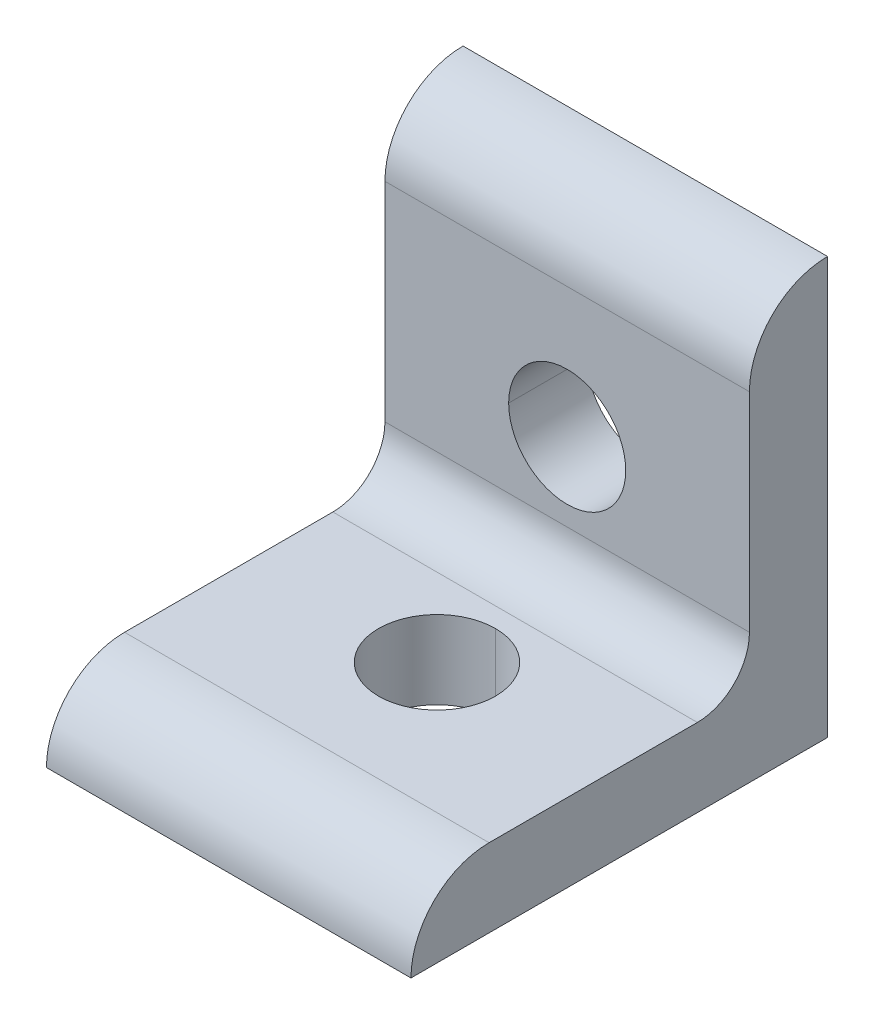
ISO-10303-21;
HEADER;
FILE_DESCRIPTION(('STEP AP214'),'2;1');
FILE_NAME('part.step','',(''),(''),'','','');
FILE_SCHEMA(('AUTOMOTIVE_DESIGN { 1 0 10303 214 1 1 1 1 }'));
ENDSEC;
DATA;
#1=APPLICATION_CONTEXT('core data for automotive mechanical design processes');
#2=APPLICATION_PROTOCOL_DEFINITION('international standard','automotive_design',2000,#1);
#3=PRODUCT_CONTEXT('',#1,'mechanical');
#4=PRODUCT('Part','Part','',(#3));
#5=PRODUCT_RELATED_PRODUCT_CATEGORY('part','',(#4));
#6=PRODUCT_DEFINITION_FORMATION('','',#4);
#7=PRODUCT_DEFINITION_CONTEXT('part definition',#1,'design');
#8=PRODUCT_DEFINITION('design','',#6,#7);
#9=PRODUCT_DEFINITION_SHAPE('','',#8);
#10=(LENGTH_UNIT() NAMED_UNIT(*) SI_UNIT(.MILLI.,.METRE.));
#11=(NAMED_UNIT(*) PLANE_ANGLE_UNIT() SI_UNIT($,.RADIAN.));
#12=(NAMED_UNIT(*) SI_UNIT($,.STERADIAN.) SOLID_ANGLE_UNIT());
#13=UNCERTAINTY_MEASURE_WITH_UNIT(LENGTH_MEASURE(1.E-05),#10,'distance_accuracy_value','');
#14=(GEOMETRIC_REPRESENTATION_CONTEXT(3) GLOBAL_UNCERTAINTY_ASSIGNED_CONTEXT((#13)) GLOBAL_UNIT_ASSIGNED_CONTEXT((#10,
#11,#12)) REPRESENTATION_CONTEXT('',''));
#15=CARTESIAN_POINT('',(0.,0.,0.));
#16=DIRECTION('',(0.,0.,1.));
#17=DIRECTION('',(1.,0.,0.));
#18=AXIS2_PLACEMENT_3D('',#15,#16,#17);
#19=CARTESIAN_POINT('',(11.1125,0.,20.6375));
#20=DIRECTION('',(-1.,0.,0.));
#21=DIRECTION('',(0.,-0.707106781186543,-0.707106781186552));
#22=AXIS2_PLACEMENT_3D('',#19,#20,#21);
#23=CYLINDRICAL_SURFACE('',#22,4.76249999999994);
#24=CARTESIAN_POINT('',(-11.1125,0.,20.6375));
#25=DIRECTION('',(1.,0.,0.));
#26=DIRECTION('',(0.,0.,-1.));
#27=AXIS2_PLACEMENT_3D('',#24,#25,#26);
#28=CIRCLE('',#27,4.76249999999994);
#29=CARTESIAN_POINT('',(-11.1125,4.7625,20.6375));
#30=VERTEX_POINT('',#29);
#31=CARTESIAN_POINT('',(-11.1125,0.,25.4));
#32=VERTEX_POINT('',#31);
#33=EDGE_CURVE('E11',#30,#32,#28,.T.);
#34=ORIENTED_EDGE('',*,*,#33,.T.);
#35=DIRECTION('',(-1.,0.,0.));
#36=VECTOR('',#35,1.);
#37=CARTESIAN_POINT('',(11.1125,0.,25.4));
#38=LINE('',#37,#36);
#39=CARTESIAN_POINT('',(11.1125,0.,25.4));
#40=VERTEX_POINT('',#39);
#41=EDGE_CURVE('E26',#40,#32,#38,.T.);
#42=ORIENTED_EDGE('',*,*,#41,.F.);
#43=CARTESIAN_POINT('',(11.1125,0.,20.6375));
#44=DIRECTION('',(1.,0.,0.));
#45=DIRECTION('',(0.,0.,-1.));
#46=AXIS2_PLACEMENT_3D('',#43,#44,#45);
#47=CIRCLE('',#46,4.76249999999994);
#48=CARTESIAN_POINT('',(11.1125,4.7625,20.6375));
#49=VERTEX_POINT('',#48);
#50=EDGE_CURVE('E269',#49,#40,#47,.T.);
#51=ORIENTED_EDGE('',*,*,#50,.F.);
#52=DIRECTION('',(-1.,0.,0.));
#53=VECTOR('',#52,1.);
#54=CARTESIAN_POINT('',(11.1125,4.7625,20.6375));
#55=LINE('',#54,#53);
#56=EDGE_CURVE('E264',#49,#30,#55,.T.);
#57=ORIENTED_EDGE('',*,*,#56,.T.);
#58=EDGE_LOOP('',(#34,#42,#51,#57));
#59=FACE_BOUND('',#58,.T.);
#60=ADVANCED_FACE('F17',(#59),#23,.T.);
#61=CARTESIAN_POINT('',(11.1125,4.7625,7.9375));
#62=DIRECTION('',(0.,-1.,0.));
#63=DIRECTION('',(0.,0.,-1.));
#64=AXIS2_PLACEMENT_3D('',#61,#62,#63);
#65=PLANE('',#64);
#66=CARTESIAN_POINT('',(0.,4.7625,12.7));
#67=DIRECTION('',(0.,1.,0.));
#68=DIRECTION('',(1.,0.,0.));
#69=AXIS2_PLACEMENT_3D('',#66,#67,#68);
#70=CIRCLE('',#69,3.5687);
#71=CARTESIAN_POINT('',(0.,4.7625,9.1313));
#72=VERTEX_POINT('',#71);
#73=CARTESIAN_POINT('',(0.,4.7625,16.2687));
#74=VERTEX_POINT('',#73);
#75=EDGE_CURVE('E259',#72,#74,#70,.T.);
#76=ORIENTED_EDGE('',*,*,#75,.F.);
#77=CARTESIAN_POINT('',(0.,4.7625,12.7));
#78=DIRECTION('',(0.,1.,0.));
#79=DIRECTION('',(0.,0.,1.));
#80=AXIS2_PLACEMENT_3D('',#77,#78,#79);
#81=CIRCLE('',#80,3.5687);
#82=EDGE_CURVE('E119',#74,#72,#81,.T.);
#83=ORIENTED_EDGE('',*,*,#82,.F.);
#84=EDGE_LOOP('',(#76,#83));
#85=FACE_BOUND('',#84,.T.);
#86=DIRECTION('',(0.,0.,1.));
#87=VECTOR('',#86,1.);
#88=CARTESIAN_POINT('',(-11.1125,4.7625,7.9375));
#89=LINE('',#88,#87);
#90=CARTESIAN_POINT('',(-11.1125,4.7625,7.9375));
#91=VERTEX_POINT('',#90);
#92=EDGE_CURVE('E249',#91,#30,#89,.T.);
#93=ORIENTED_EDGE('',*,*,#92,.T.);
#94=ORIENTED_EDGE('',*,*,#56,.F.);
#95=DIRECTION('',(0.,0.,1.));
#96=VECTOR('',#95,1.);
#97=CARTESIAN_POINT('',(11.1125,4.7625,7.9375));
#98=LINE('',#97,#96);
#99=CARTESIAN_POINT('',(11.1125,4.7625,7.9375));
#100=VERTEX_POINT('',#99);
#101=EDGE_CURVE('E243',#100,#49,#98,.T.);
#102=ORIENTED_EDGE('',*,*,#101,.F.);
#103=DIRECTION('',(-1.,0.,0.));
#104=VECTOR('',#103,1.);
#105=CARTESIAN_POINT('',(11.1125,4.7625,7.9375));
#106=LINE('',#105,#104);
#107=EDGE_CURVE('E238',#100,#91,#106,.T.);
#108=ORIENTED_EDGE('',*,*,#107,.T.);
#109=EDGE_LOOP('',(#93,#94,#102,#108));
#110=FACE_BOUND('',#109,.T.);
#111=ADVANCED_FACE('F287',(#85,#110),#65,.F.);
#112=CARTESIAN_POINT('',(11.1125,7.9375,7.9375));
#113=DIRECTION('',(-1.,0.,0.));
#114=DIRECTION('',(0.,0.707106781186548,0.707106781186547));
#115=AXIS2_PLACEMENT_3D('',#112,#113,#114);
#116=CYLINDRICAL_SURFACE('',#115,3.17499999999996);
#117=CARTESIAN_POINT('',(-11.1125,7.9375,7.9375));
#118=DIRECTION('',(1.,0.,0.));
#119=DIRECTION('',(0.,0.,-1.));
#120=AXIS2_PLACEMENT_3D('',#117,#118,#119);
#121=CIRCLE('',#120,3.17499999999996);
#122=CARTESIAN_POINT('',(-11.1125,7.9375,4.7625));
#123=VERTEX_POINT('',#122);
#124=EDGE_CURVE('E232',#91,#123,#121,.T.);
#125=ORIENTED_EDGE('',*,*,#124,.F.);
#126=ORIENTED_EDGE('',*,*,#107,.F.);
#127=CARTESIAN_POINT('',(11.1125,7.9375,7.9375));
#128=DIRECTION('',(1.,0.,0.));
#129=DIRECTION('',(0.,0.,-1.));
#130=AXIS2_PLACEMENT_3D('',#127,#128,#129);
#131=CIRCLE('',#130,3.17499999999996);
#132=CARTESIAN_POINT('',(11.1125,7.9375,4.7625));
#133=VERTEX_POINT('',#132);
#134=EDGE_CURVE('E227',#100,#133,#131,.T.);
#135=ORIENTED_EDGE('',*,*,#134,.T.);
#136=DIRECTION('',(-1.,0.,0.));
#137=VECTOR('',#136,1.);
#138=CARTESIAN_POINT('',(11.1125,7.9375,4.7625));
#139=LINE('',#138,#137);
#140=EDGE_CURVE('E222',#133,#123,#139,.T.);
#141=ORIENTED_EDGE('',*,*,#140,.T.);
#142=EDGE_LOOP('',(#125,#126,#135,#141));
#143=FACE_BOUND('',#142,.T.);
#144=ADVANCED_FACE('F305',(#143),#116,.F.);
#145=CARTESIAN_POINT('',(11.1125,20.6375,4.7625));
#146=DIRECTION('',(0.,0.,-1.));
#147=DIRECTION('',(-1.,0.,0.));
#148=AXIS2_PLACEMENT_3D('',#145,#146,#147);
#149=PLANE('',#148);
#150=CARTESIAN_POINT('',(0.,12.7,4.7625));
#151=DIRECTION('',(0.,0.,1.));
#152=DIRECTION('',(1.,0.,0.));
#153=AXIS2_PLACEMENT_3D('',#150,#151,#152);
#154=CIRCLE('',#153,3.5687);
#155=CARTESIAN_POINT('',(-3.5687,12.7,4.7625));
#156=VERTEX_POINT('',#155);
#157=CARTESIAN_POINT('',(3.5687,12.7,4.7625));
#158=VERTEX_POINT('',#157);
#159=EDGE_CURVE('E216',#156,#158,#154,.T.);
#160=ORIENTED_EDGE('',*,*,#159,.F.);
#161=CARTESIAN_POINT('',(0.,12.7,4.7625));
#162=DIRECTION('',(0.,0.,1.));
#163=DIRECTION('',(1.,0.,0.));
#164=AXIS2_PLACEMENT_3D('',#161,#162,#163);
#165=CIRCLE('',#164,3.5687);
#166=EDGE_CURVE('E210',#158,#156,#165,.T.);
#167=ORIENTED_EDGE('',*,*,#166,.F.);
#168=EDGE_LOOP('',(#160,#167));
#169=FACE_BOUND('',#168,.T.);
#170=DIRECTION('',(0.,-1.,0.));
#171=VECTOR('',#170,1.);
#172=CARTESIAN_POINT('',(-11.1125,20.6375,4.7625));
#173=LINE('',#172,#171);
#174=CARTESIAN_POINT('',(-11.1125,20.6375,4.7625));
#175=VERTEX_POINT('',#174);
#176=EDGE_CURVE('E204',#175,#123,#173,.T.);
#177=ORIENTED_EDGE('',*,*,#176,.T.);
#178=ORIENTED_EDGE('',*,*,#140,.F.);
#179=DIRECTION('',(0.,-1.,0.));
#180=VECTOR('',#179,1.);
#181=CARTESIAN_POINT('',(11.1125,20.6375,4.7625));
#182=LINE('',#181,#180);
#183=CARTESIAN_POINT('',(11.1125,20.6375,4.7625));
#184=VERTEX_POINT('',#183);
#185=EDGE_CURVE('E198',#184,#133,#182,.T.);
#186=ORIENTED_EDGE('',*,*,#185,.F.);
#187=DIRECTION('',(-1.,0.,0.));
#188=VECTOR('',#187,1.);
#189=CARTESIAN_POINT('',(11.1125,20.6375,4.7625));
#190=LINE('',#189,#188);
#191=EDGE_CURVE('E193',#184,#175,#190,.T.);
#192=ORIENTED_EDGE('',*,*,#191,.T.);
#193=EDGE_LOOP('',(#177,#178,#186,#192));
#194=FACE_BOUND('',#193,.T.);
#195=ADVANCED_FACE('F303',(#169,#194),#149,.F.);
#196=CARTESIAN_POINT('',(11.1125,20.6375,0.));
#197=DIRECTION('',(-1.,0.,0.));
#198=DIRECTION('',(0.,-0.707106781186553,-0.707106781186542));
#199=AXIS2_PLACEMENT_3D('',#196,#197,#198);
#200=CYLINDRICAL_SURFACE('',#199,4.76249999999994);
#201=CARTESIAN_POINT('',(-11.1125,20.6375,0.));
#202=DIRECTION('',(1.,0.,0.));
#203=DIRECTION('',(0.,0.,-1.));
#204=AXIS2_PLACEMENT_3D('',#201,#202,#203);
#205=CIRCLE('',#204,4.76249999999994);
#206=CARTESIAN_POINT('',(-11.1125,25.4,0.));
#207=VERTEX_POINT('',#206);
#208=EDGE_CURVE('E187',#207,#175,#205,.T.);
#209=ORIENTED_EDGE('',*,*,#208,.T.);
#210=ORIENTED_EDGE('',*,*,#191,.F.);
#211=CARTESIAN_POINT('',(11.1125,20.6375,0.));
#212=DIRECTION('',(1.,0.,0.));
#213=DIRECTION('',(0.,0.,-1.));
#214=AXIS2_PLACEMENT_3D('',#211,#212,#213);
#215=CIRCLE('',#214,4.76249999999994);
#216=CARTESIAN_POINT('',(11.1125,25.4,0.));
#217=VERTEX_POINT('',#216);
#218=EDGE_CURVE('E181',#217,#184,#215,.T.);
#219=ORIENTED_EDGE('',*,*,#218,.F.);
#220=DIRECTION('',(-1.,0.,0.));
#221=VECTOR('',#220,1.);
#222=CARTESIAN_POINT('',(11.1125,25.4,0.));
#223=LINE('',#222,#221);
#224=EDGE_CURVE('E176',#217,#207,#223,.T.);
#225=ORIENTED_EDGE('',*,*,#224,.T.);
#226=EDGE_LOOP('',(#209,#210,#219,#225));
#227=FACE_BOUND('',#226,.T.);
#228=ADVANCED_FACE('F301',(#227),#200,.T.);
#229=CARTESIAN_POINT('',(11.1125,0.,0.));
#230=DIRECTION('',(0.,0.,1.));
#231=DIRECTION('',(1.,0.,0.));
#232=AXIS2_PLACEMENT_3D('',#229,#230,#231);
#233=PLANE('',#232);
#234=CARTESIAN_POINT('',(0.,12.7,0.));
#235=DIRECTION('',(0.,0.,1.));
#236=DIRECTION('',(1.,0.,0.));
#237=AXIS2_PLACEMENT_3D('',#234,#235,#236);
#238=CIRCLE('',#237,3.5687);
#239=CARTESIAN_POINT('',(3.5687,12.7,0.));
#240=VERTEX_POINT('',#239);
#241=CARTESIAN_POINT('',(-3.5687,12.7,0.));
#242=VERTEX_POINT('',#241);
#243=EDGE_CURVE('E171',#240,#242,#238,.T.);
#244=ORIENTED_EDGE('',*,*,#243,.T.);
#245=CARTESIAN_POINT('',(0.,12.7,0.));
#246=DIRECTION('',(0.,0.,1.));
#247=DIRECTION('',(1.,0.,0.));
#248=AXIS2_PLACEMENT_3D('',#245,#246,#247);
#249=CIRCLE('',#248,3.5687);
#250=EDGE_CURVE('E166',#242,#240,#249,.T.);
#251=ORIENTED_EDGE('',*,*,#250,.T.);
#252=EDGE_LOOP('',(#244,#251));
#253=FACE_BOUND('',#252,.T.);
#254=DIRECTION('',(0.,1.,0.));
#255=VECTOR('',#254,1.);
#256=CARTESIAN_POINT('',(-11.1125,0.,0.));
#257=LINE('',#256,#255);
#258=CARTESIAN_POINT('',(-11.1125,0.,0.));
#259=VERTEX_POINT('',#258);
#260=EDGE_CURVE('E160',#259,#207,#257,.T.);
#261=ORIENTED_EDGE('',*,*,#260,.T.);
#262=ORIENTED_EDGE('',*,*,#224,.F.);
#263=DIRECTION('',(0.,1.,0.));
#264=VECTOR('',#263,1.);
#265=CARTESIAN_POINT('',(11.1125,0.,0.));
#266=LINE('',#265,#264);
#267=CARTESIAN_POINT('',(11.1125,0.,0.));
#268=VERTEX_POINT('',#267);
#269=EDGE_CURVE('E154',#268,#217,#266,.T.);
#270=ORIENTED_EDGE('',*,*,#269,.F.);
#271=DIRECTION('',(-1.,0.,0.));
#272=VECTOR('',#271,1.);
#273=CARTESIAN_POINT('',(11.1125,0.,0.));
#274=LINE('',#273,#272);
#275=EDGE_CURVE('E116',#268,#259,#274,.T.);
#276=ORIENTED_EDGE('',*,*,#275,.T.);
#277=EDGE_LOOP('',(#261,#262,#270,#276));
#278=FACE_BOUND('',#277,.T.);
#279=ADVANCED_FACE('F297',(#253,#278),#233,.F.);
#280=CARTESIAN_POINT('',(11.1125,0.,25.4));
#281=DIRECTION('',(0.,1.,0.));
#282=DIRECTION('',(0.,0.,1.));
#283=AXIS2_PLACEMENT_3D('',#280,#281,#282);
#284=PLANE('',#283);
#285=CARTESIAN_POINT('',(0.,0.,12.7));
#286=DIRECTION('',(0.,1.,0.));
#287=DIRECTION('',(1.,0.,0.));
#288=AXIS2_PLACEMENT_3D('',#285,#286,#287);
#289=CIRCLE('',#288,3.5687);
#290=CARTESIAN_POINT('',(0.,0.,9.1313));
#291=VERTEX_POINT('',#290);
#292=CARTESIAN_POINT('',(0.,0.,16.2687));
#293=VERTEX_POINT('',#292);
#294=EDGE_CURVE('E100',#291,#293,#289,.T.);
#295=ORIENTED_EDGE('',*,*,#294,.T.);
#296=CARTESIAN_POINT('',(0.,0.,12.7));
#297=DIRECTION('',(0.,1.,0.));
#298=DIRECTION('',(0.,0.,1.));
#299=AXIS2_PLACEMENT_3D('',#296,#297,#298);
#300=CIRCLE('',#299,3.5687);
#301=EDGE_CURVE('E96',#293,#291,#300,.T.);
#302=ORIENTED_EDGE('',*,*,#301,.T.);
#303=EDGE_LOOP('',(#295,#302));
#304=FACE_BOUND('',#303,.T.);
#305=DIRECTION('',(0.,0.,-1.));
#306=VECTOR('',#305,1.);
#307=CARTESIAN_POINT('',(-11.1125,0.,25.4));
#308=LINE('',#307,#306);
#309=EDGE_CURVE('E106',#32,#259,#308,.T.);
#310=ORIENTED_EDGE('',*,*,#309,.T.);
#311=ORIENTED_EDGE('',*,*,#275,.F.);
#312=DIRECTION('',(0.,0.,-1.));
#313=VECTOR('',#312,1.);
#314=CARTESIAN_POINT('',(11.1125,0.,25.4));
#315=LINE('',#314,#313);
#316=EDGE_CURVE('E126',#40,#268,#315,.T.);
#317=ORIENTED_EDGE('',*,*,#316,.F.);
#318=ORIENTED_EDGE('',*,*,#41,.T.);
#319=EDGE_LOOP('',(#310,#311,#317,#318));
#320=FACE_BOUND('',#319,.T.);
#321=ADVANCED_FACE('F98',(#304,#320),#284,.F.);
#322=CARTESIAN_POINT('',(11.1125,0.,20.6375));
#323=DIRECTION('',(1.,0.,0.));
#324=DIRECTION('',(0.,0.,-1.));
#325=AXIS2_PLACEMENT_3D('',#322,#323,#324);
#326=PLANE('',#325);
#327=ORIENTED_EDGE('',*,*,#50,.T.);
#328=ORIENTED_EDGE('',*,*,#316,.T.);
#329=ORIENTED_EDGE('',*,*,#269,.T.);
#330=ORIENTED_EDGE('',*,*,#218,.T.);
#331=ORIENTED_EDGE('',*,*,#185,.T.);
#332=ORIENTED_EDGE('',*,*,#134,.F.);
#333=ORIENTED_EDGE('',*,*,#101,.T.);
#334=EDGE_LOOP('',(#327,#328,#329,#330,#331,#332,#333));
#335=FACE_BOUND('',#334,.T.);
#336=ADVANCED_FACE('F283',(#335),#326,.T.);
#337=CARTESIAN_POINT('',(-11.1125,0.,20.6375));
#338=DIRECTION('',(1.,0.,0.));
#339=DIRECTION('',(0.,0.,-1.));
#340=AXIS2_PLACEMENT_3D('',#337,#338,#339);
#341=PLANE('',#340);
#342=ORIENTED_EDGE('',*,*,#33,.F.);
#343=ORIENTED_EDGE('',*,*,#92,.F.);
#344=ORIENTED_EDGE('',*,*,#124,.T.);
#345=ORIENTED_EDGE('',*,*,#176,.F.);
#346=ORIENTED_EDGE('',*,*,#208,.F.);
#347=ORIENTED_EDGE('',*,*,#260,.F.);
#348=ORIENTED_EDGE('',*,*,#309,.F.);
#349=EDGE_LOOP('',(#342,#343,#344,#345,#346,#347,#348));
#350=FACE_BOUND('',#349,.T.);
#351=ADVANCED_FACE('F292',(#350),#341,.F.);
#352=CARTESIAN_POINT('',(0.,4.7625,12.7));
#353=DIRECTION('',(0.,-1.,0.));
#354=DIRECTION('',(-1.,0.,0.));
#355=AXIS2_PLACEMENT_3D('',#352,#353,#354);
#356=CYLINDRICAL_SURFACE('',#355,3.5687);
#357=DIRECTION('',(0.,-1.,0.));
#358=VECTOR('',#357,1.);
#359=CARTESIAN_POINT('',(0.,4.7625,16.2687));
#360=LINE('',#359,#358);
#361=EDGE_CURVE('E114',#74,#293,#360,.T.);
#362=ORIENTED_EDGE('',*,*,#361,.F.);
#363=ORIENTED_EDGE('',*,*,#82,.T.);
#364=DIRECTION('',(0.,-1.,0.));
#365=VECTOR('',#364,1.);
#366=CARTESIAN_POINT('',(0.,4.7625,9.1313));
#367=LINE('',#366,#365);
#368=EDGE_CURVE('E112',#72,#291,#367,.T.);
#369=ORIENTED_EDGE('',*,*,#368,.T.);
#370=ORIENTED_EDGE('',*,*,#301,.F.);
#371=EDGE_LOOP('',(#362,#363,#369,#370));
#372=FACE_BOUND('',#371,.T.);
#373=ADVANCED_FACE('F118',(#372),#356,.F.);
#374=CARTESIAN_POINT('',(0.,4.7625,12.7));
#375=DIRECTION('',(0.,-1.,0.));
#376=DIRECTION('',(1.,0.,0.));
#377=AXIS2_PLACEMENT_3D('',#374,#375,#376);
#378=CYLINDRICAL_SURFACE('',#377,3.5687);
#379=ORIENTED_EDGE('',*,*,#361,.T.);
#380=ORIENTED_EDGE('',*,*,#294,.F.);
#381=ORIENTED_EDGE('',*,*,#368,.F.);
#382=ORIENTED_EDGE('',*,*,#75,.T.);
#383=EDGE_LOOP('',(#379,#380,#381,#382));
#384=FACE_BOUND('',#383,.T.);
#385=ADVANCED_FACE('F110',(#384),#378,.F.);
#386=CARTESIAN_POINT('',(0.,12.7,4.7625));
#387=DIRECTION('',(0.,0.,-1.));
#388=DIRECTION('',(0.,1.,0.));
#389=AXIS2_PLACEMENT_3D('',#386,#387,#388);
#390=CYLINDRICAL_SURFACE('',#389,3.5687);
#391=DIRECTION('',(0.,0.,-1.));
#392=VECTOR('',#391,1.);
#393=CARTESIAN_POINT('',(3.5687,12.7,4.7625));
#394=LINE('',#393,#392);
#395=EDGE_CURVE('E121',#158,#240,#394,.T.);
#396=ORIENTED_EDGE('',*,*,#395,.T.);
#397=ORIENTED_EDGE('',*,*,#250,.F.);
#398=DIRECTION('',(0.,0.,-1.));
#399=VECTOR('',#398,1.);
#400=CARTESIAN_POINT('',(-3.5687,12.7,4.7625));
#401=LINE('',#400,#399);
#402=EDGE_CURVE('E129',#156,#242,#401,.T.);
#403=ORIENTED_EDGE('',*,*,#402,.F.);
#404=ORIENTED_EDGE('',*,*,#159,.T.);
#405=EDGE_LOOP('',(#396,#397,#403,#404));
#406=FACE_BOUND('',#405,.T.);
#407=ADVANCED_FACE('F385',(#406),#390,.F.);
#408=CARTESIAN_POINT('',(0.,12.7,4.7625));
#409=DIRECTION('',(0.,0.,-1.));
#410=DIRECTION('',(0.,-1.,0.));
#411=AXIS2_PLACEMENT_3D('',#408,#409,#410);
#412=CYLINDRICAL_SURFACE('',#411,3.5687);
#413=ORIENTED_EDGE('',*,*,#395,.F.);
#414=ORIENTED_EDGE('',*,*,#166,.T.);
#415=ORIENTED_EDGE('',*,*,#402,.T.);
#416=ORIENTED_EDGE('',*,*,#243,.F.);
#417=EDGE_LOOP('',(#413,#414,#415,#416));
#418=FACE_BOUND('',#417,.T.);
#419=ADVANCED_FACE('F393',(#418),#412,.F.);
#420=CLOSED_SHELL('',(#60,#111,#144,#195,#228,#279,#321,#336,#351,#373,#385,#407,#419));
#421=MANIFOLD_SOLID_BREP('B1',#420);
#422=ADVANCED_BREP_SHAPE_REPRESENTATION('',(#18,#421),#14);
#423=SHAPE_DEFINITION_REPRESENTATION(#9,#422);
ENDSEC;
END-ISO-10303-21;
